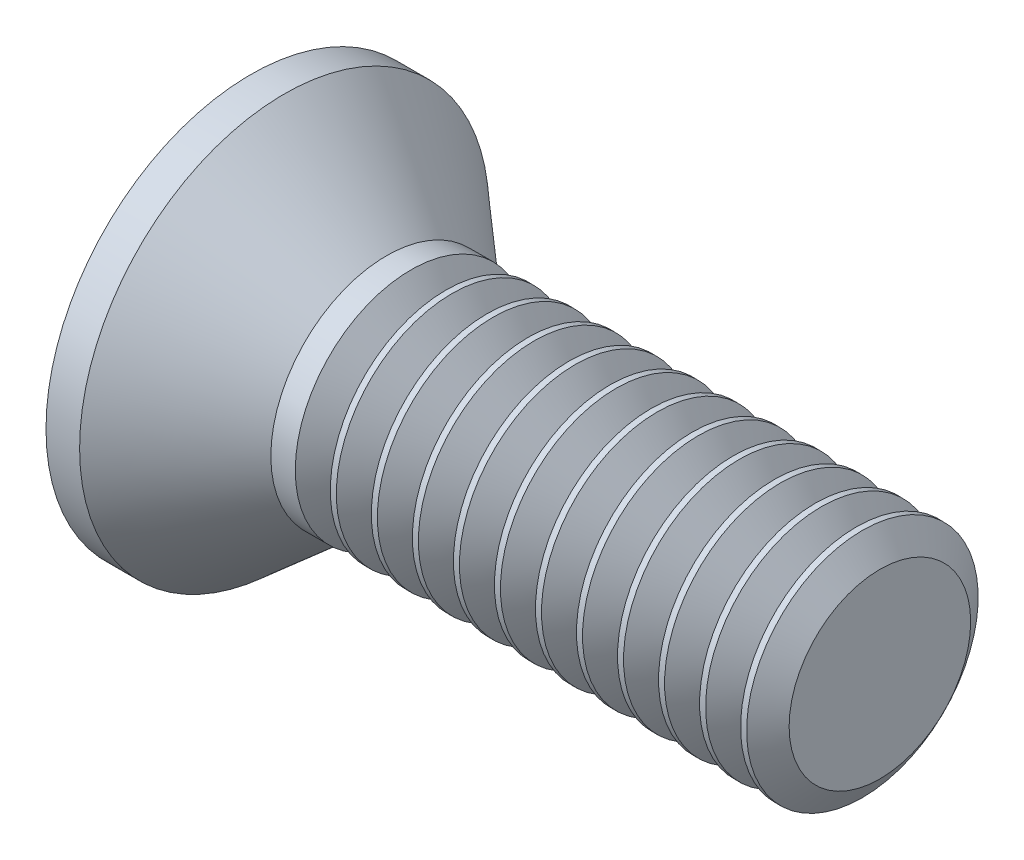
ISO-10303-21;
HEADER;
FILE_DESCRIPTION(('STEP AP214'),'2;1');
FILE_NAME('part.step','',(''),(''),'','','');
FILE_SCHEMA(('AUTOMOTIVE_DESIGN { 1 0 10303 214 1 1 1 1 }'));
ENDSEC;
DATA;
#1=APPLICATION_CONTEXT('core data for automotive mechanical design processes');
#2=APPLICATION_PROTOCOL_DEFINITION('international standard','automotive_design',2000,#1);
#3=PRODUCT_CONTEXT('',#1,'mechanical');
#4=PRODUCT('Part','Part','',(#3));
#5=PRODUCT_RELATED_PRODUCT_CATEGORY('part','',(#4));
#6=PRODUCT_DEFINITION_FORMATION('','',#4);
#7=PRODUCT_DEFINITION_CONTEXT('part definition',#1,'design');
#8=PRODUCT_DEFINITION('design','',#6,#7);
#9=PRODUCT_DEFINITION_SHAPE('','',#8);
#10=(LENGTH_UNIT() NAMED_UNIT(*) SI_UNIT(.MILLI.,.METRE.));
#11=(NAMED_UNIT(*) PLANE_ANGLE_UNIT() SI_UNIT($,.RADIAN.));
#12=(NAMED_UNIT(*) SI_UNIT($,.STERADIAN.) SOLID_ANGLE_UNIT());
#13=UNCERTAINTY_MEASURE_WITH_UNIT(LENGTH_MEASURE(1.E-05),#10,'distance_accuracy_value','');
#14=(GEOMETRIC_REPRESENTATION_CONTEXT(3) GLOBAL_UNCERTAINTY_ASSIGNED_CONTEXT((#13)) GLOBAL_UNIT_ASSIGNED_CONTEXT((#10,
#11,#12)) REPRESENTATION_CONTEXT('',''));
#15=CARTESIAN_POINT('',(0.,0.,0.));
#16=DIRECTION('',(0.,0.,1.));
#17=DIRECTION('',(1.,0.,0.));
#18=AXIS2_PLACEMENT_3D('',#15,#16,#17);
#19=CARTESIAN_POINT('',(0.,0.,0.));
#20=DIRECTION('',(-1.,0.,0.));
#21=DIRECTION('',(0.,0.,1.));
#22=AXIS2_PLACEMENT_3D('',#19,#20,#21);
#23=PLANE('',#22);
#24=CARTESIAN_POINT('',(0.,0.,0.));
#25=DIRECTION('',(-1.,0.,0.));
#26=DIRECTION('',(0.,0.,1.));
#27=AXIS2_PLACEMENT_3D('',#24,#25,#26);
#28=CIRCLE('',#27,3.0988);
#29=CARTESIAN_POINT('',(0.,0.,3.0988));
#30=VERTEX_POINT('',#29);
#31=EDGE_CURVE('E42',#30,#30,#28,.T.);
#32=ORIENTED_EDGE('',*,*,#31,.T.);
#33=EDGE_LOOP('',(#32));
#34=FACE_BOUND('',#33,.T.);
#35=DIRECTION('',(0.,1.,0.));
#36=VECTOR('',#35,1.);
#37=CARTESIAN_POINT('',(0.,-2.4765,-0.4826));
#38=LINE('',#37,#36);
#39=CARTESIAN_POINT('',(0.,-2.4765,-0.4826));
#40=VERTEX_POINT('',#39);
#41=CARTESIAN_POINT('',(0.,-0.482599999999998,-0.4826));
#42=VERTEX_POINT('',#41);
#43=EDGE_CURVE('E103',#40,#42,#38,.T.);
#44=ORIENTED_EDGE('',*,*,#43,.T.);
#45=DIRECTION('',(0.,0.,-1.));
#46=VECTOR('',#45,1.);
#47=CARTESIAN_POINT('',(0.,-0.482600000000008,2.4765));
#48=LINE('',#47,#46);
#49=CARTESIAN_POINT('',(0.,-0.482599999999992,-2.4765));
#50=VERTEX_POINT('',#49);
#51=EDGE_CURVE('E83',#42,#50,#48,.T.);
#52=ORIENTED_EDGE('',*,*,#51,.T.);
#53=DIRECTION('',(0.,1.,0.));
#54=VECTOR('',#53,1.);
#55=CARTESIAN_POINT('',(0.,-0.482599999999992,-2.4765));
#56=LINE('',#55,#54);
#57=CARTESIAN_POINT('',(0.,0.482600000000008,-2.4765));
#58=VERTEX_POINT('',#57);
#59=EDGE_CURVE('E434',#50,#58,#56,.T.);
#60=ORIENTED_EDGE('',*,*,#59,.T.);
#61=DIRECTION('',(0.,0.,1.));
#62=VECTOR('',#61,1.);
#63=CARTESIAN_POINT('',(0.,0.482600000000008,-2.4765));
#64=LINE('',#63,#62);
#65=CARTESIAN_POINT('',(0.,0.482600000000001,-0.4826));
#66=VERTEX_POINT('',#65);
#67=EDGE_CURVE('E99',#58,#66,#64,.T.);
#68=ORIENTED_EDGE('',*,*,#67,.T.);
#69=CARTESIAN_POINT('',(0.,2.4765,-0.4826));
#70=VERTEX_POINT('',#69);
#71=EDGE_CURVE('E93',#66,#70,#38,.T.);
#72=ORIENTED_EDGE('',*,*,#71,.T.);
#73=DIRECTION('',(0.,0.,1.));
#74=VECTOR('',#73,1.);
#75=CARTESIAN_POINT('',(0.,2.4765,-0.4826));
#76=LINE('',#75,#74);
#77=CARTESIAN_POINT('',(0.,2.4765,0.4826));
#78=VERTEX_POINT('',#77);
#79=EDGE_CURVE('E96',#70,#78,#76,.T.);
#80=ORIENTED_EDGE('',*,*,#79,.T.);
#81=DIRECTION('',(0.,-1.,0.));
#82=VECTOR('',#81,1.);
#83=CARTESIAN_POINT('',(0.,2.4765,0.4826));
#84=LINE('',#83,#82);
#85=CARTESIAN_POINT('',(0.,0.482599999999998,0.4826));
#86=VERTEX_POINT('',#85);
#87=EDGE_CURVE('E452',#78,#86,#84,.T.);
#88=ORIENTED_EDGE('',*,*,#87,.T.);
#89=CARTESIAN_POINT('',(0.,0.482599999999991,2.4765));
#90=VERTEX_POINT('',#89);
#91=EDGE_CURVE('E437',#86,#90,#64,.T.);
#92=ORIENTED_EDGE('',*,*,#91,.T.);
#93=DIRECTION('',(0.,-1.,0.));
#94=VECTOR('',#93,1.);
#95=CARTESIAN_POINT('',(0.,0.482599999999991,2.4765));
#96=LINE('',#95,#94);
#97=CARTESIAN_POINT('',(0.,-0.482600000000008,2.4765));
#98=VERTEX_POINT('',#97);
#99=EDGE_CURVE('E428',#90,#98,#96,.T.);
#100=ORIENTED_EDGE('',*,*,#99,.T.);
#101=CARTESIAN_POINT('',(0.,-0.482600000000002,0.4826));
#102=VERTEX_POINT('',#101);
#103=EDGE_CURVE('E431',#98,#102,#48,.T.);
#104=ORIENTED_EDGE('',*,*,#103,.T.);
#105=CARTESIAN_POINT('',(0.,-2.4765,0.4826));
#106=VERTEX_POINT('',#105);
#107=EDGE_CURVE('E109',#102,#106,#84,.T.);
#108=ORIENTED_EDGE('',*,*,#107,.T.);
#109=DIRECTION('',(0.,0.,-1.));
#110=VECTOR('',#109,1.);
#111=CARTESIAN_POINT('',(0.,-2.4765,0.4826));
#112=LINE('',#111,#110);
#113=EDGE_CURVE('E132',#106,#40,#112,.T.);
#114=ORIENTED_EDGE('',*,*,#113,.T.);
#115=EDGE_LOOP('',(#44,#52,#60,#68,#72,#80,#88,#92,#100,#104,#108,#114));
#116=FACE_BOUND('',#115,.T.);
#117=ADVANCED_FACE('F35',(#34,#116),#23,.T.);
#118=CARTESIAN_POINT('',(3.18005113636364,0.,0.215250568181818));
#119=DIRECTION('',(-0.0837752602144701,0.,-0.996484674130013));
#120=DIRECTION('',(-0.996484674130013,0.,0.0837752602144701));
#121=AXIS2_PLACEMENT_3D('',#118,#119,#120);
#122=PLANE('',#121);
#123=ORIENTED_EDGE('',*,*,#107,.F.);
#124=DIRECTION('',(0.993006162058238,0.0834828189341,-0.0834828189340997));
#125=VECTOR('',#124,1.);
#126=CARTESIAN_POINT('',(3.19789518323365,-0.213750404949384,0.213750404949384));
#127=LINE('',#126,#125);
#128=CARTESIAN_POINT('',(2.8702,-0.241300000000001,0.241299999999999));
#129=VERTEX_POINT('',#128);
#130=EDGE_CURVE('E127',#102,#129,#127,.T.);
#131=ORIENTED_EDGE('',*,*,#130,.T.);
#132=DIRECTION('',(0.78724620786628,0.613076692851616,-0.0661844157055723));
#133=VECTOR('',#132,1.);
#134=CARTESIAN_POINT('',(0.,-2.4765,0.4826));
#135=LINE('',#134,#133);
#136=EDGE_CURVE('E104',#106,#129,#135,.T.);
#137=ORIENTED_EDGE('',*,*,#136,.F.);
#138=EDGE_LOOP('',(#123,#131,#137));
#139=FACE_BOUND('',#138,.T.);
#140=ADVANCED_FACE('F152',(#139),#122,.T.);
#141=DIRECTION('',(0.78724620786628,-0.613076692851616,-0.0661844157055721));
#142=VECTOR('',#141,1.);
#143=CARTESIAN_POINT('',(0.,2.4765,0.4826));
#144=LINE('',#143,#142);
#145=CARTESIAN_POINT('',(2.8702,0.2413,0.2413));
#146=VERTEX_POINT('',#145);
#147=EDGE_CURVE('E49',#78,#146,#144,.T.);
#148=ORIENTED_EDGE('',*,*,#147,.T.);
#149=DIRECTION('',(-0.993006162058238,0.0834828189340994,0.0834828189340997));
#150=VECTOR('',#149,1.);
#151=CARTESIAN_POINT('',(3.19789518323365,0.213750404949383,0.213750404949384));
#152=LINE('',#151,#150);
#153=EDGE_CURVE('E447',#146,#86,#152,.T.);
#154=ORIENTED_EDGE('',*,*,#153,.T.);
#155=ORIENTED_EDGE('',*,*,#87,.F.);
#156=EDGE_LOOP('',(#148,#154,#155));
#157=FACE_BOUND('',#156,.T.);
#158=ADVANCED_FACE('F156',(#157),#122,.T.);
#159=CARTESIAN_POINT('',(3.18005113636364,0.,-0.215250568181818));
#160=DIRECTION('',(-0.0837752602144701,0.,0.996484674130013));
#161=DIRECTION('',(0.996484674130013,0.,0.0837752602144701));
#162=AXIS2_PLACEMENT_3D('',#159,#160,#161);
#163=PLANE('',#162);
#164=DIRECTION('',(0.78724620786628,0.613076692851616,0.0661844157055721));
#165=VECTOR('',#164,1.);
#166=CARTESIAN_POINT('',(0.,-2.4765,-0.4826));
#167=LINE('',#166,#165);
#168=CARTESIAN_POINT('',(2.8702,-0.241299999999999,-0.241300000000001));
#169=VERTEX_POINT('',#168);
#170=EDGE_CURVE('E58',#40,#169,#167,.T.);
#171=ORIENTED_EDGE('',*,*,#170,.T.);
#172=DIRECTION('',(-0.993006162058238,-0.0834828189340994,-0.0834828189340996));
#173=VECTOR('',#172,1.);
#174=CARTESIAN_POINT('',(3.19789518323365,-0.213750404949383,-0.213750404949384));
#175=LINE('',#174,#173);
#176=EDGE_CURVE('E11',#169,#42,#175,.T.);
#177=ORIENTED_EDGE('',*,*,#176,.T.);
#178=ORIENTED_EDGE('',*,*,#43,.F.);
#179=EDGE_LOOP('',(#171,#177,#178));
#180=FACE_BOUND('',#179,.T.);
#181=ADVANCED_FACE('F149',(#180),#163,.T.);
#182=ORIENTED_EDGE('',*,*,#71,.F.);
#183=DIRECTION('',(0.993006162058238,-0.0834828189340999,0.0834828189340996));
#184=VECTOR('',#183,1.);
#185=CARTESIAN_POINT('',(3.19789518323365,0.213750404949384,-0.213750404949384));
#186=LINE('',#185,#184);
#187=CARTESIAN_POINT('',(2.8702,0.2413,-0.2413));
#188=VERTEX_POINT('',#187);
#189=EDGE_CURVE('E112',#66,#188,#186,.T.);
#190=ORIENTED_EDGE('',*,*,#189,.T.);
#191=DIRECTION('',(0.78724620786628,-0.613076692851616,0.0661844157055721));
#192=VECTOR('',#191,1.);
#193=CARTESIAN_POINT('',(0.,2.4765,-0.4826));
#194=LINE('',#193,#192);
#195=EDGE_CURVE('E108',#70,#188,#194,.T.);
#196=ORIENTED_EDGE('',*,*,#195,.F.);
#197=EDGE_LOOP('',(#182,#190,#196));
#198=FACE_BOUND('',#197,.T.);
#199=ADVANCED_FACE('F111',(#198),#163,.T.);
#200=CARTESIAN_POINT('',(-6.34999999999999,0.,0.));
#201=DIRECTION('',(-1.,0.,0.));
#202=DIRECTION('',(0.,0.,1.));
#203=AXIS2_PLACEMENT_3D('',#200,#201,#202);
#204=CYLINDRICAL_SURFACE('',#203,3.0988);
#205=CARTESIAN_POINT('',(0.508774050199084,0.,0.));
#206=DIRECTION('',(-1.,0.,0.));
#207=DIRECTION('',(0.,0.,1.));
#208=AXIS2_PLACEMENT_3D('',#205,#206,#207);
#209=CIRCLE('',#208,3.0988);
#210=CARTESIAN_POINT('',(0.508774050199084,0.,3.0988));
#211=VERTEX_POINT('',#210);
#212=EDGE_CURVE('E131',#211,#211,#209,.T.);
#213=ORIENTED_EDGE('',*,*,#212,.T.);
#214=EDGE_LOOP('',(#213));
#215=FACE_BOUND('',#214,.T.);
#216=ORIENTED_EDGE('',*,*,#31,.F.);
#217=EDGE_LOOP('',(#216));
#218=FACE_BOUND('',#217,.T.);
#219=ADVANCED_FACE('F138',(#215,#218),#204,.T.);
#220=CARTESIAN_POINT('',(0.508774050199084,0.,0.));
#221=DIRECTION('',(-1.,0.,0.));
#222=DIRECTION('',(0.,0.,1.));
#223=AXIS2_PLACEMENT_3D('',#220,#221,#222);
#224=CONICAL_SURFACE('',#223,3.0988,0.715584993317677);
#225=CARTESIAN_POINT('',(2.0574,0.,0.));
#226=DIRECTION('',(-1.,0.,0.));
#227=DIRECTION('',(0.,0.,1.));
#228=AXIS2_PLACEMENT_3D('',#225,#226,#227);
#229=CIRCLE('',#228,1.7526);
#230=CARTESIAN_POINT('',(2.0574,0.,1.7526));
#231=VERTEX_POINT('',#230);
#232=EDGE_CURVE('E128',#231,#231,#229,.T.);
#233=ORIENTED_EDGE('',*,*,#232,.T.);
#234=EDGE_LOOP('',(#233));
#235=FACE_BOUND('',#234,.T.);
#236=ORIENTED_EDGE('',*,*,#212,.F.);
#237=EDGE_LOOP('',(#236));
#238=FACE_BOUND('',#237,.T.);
#239=ADVANCED_FACE('F140',(#235,#238),#224,.T.);
#240=CARTESIAN_POINT('',(-6.34999999999999,0.,0.));
#241=DIRECTION('',(-1.,0.,0.));
#242=DIRECTION('',(0.,0.,1.));
#243=AXIS2_PLACEMENT_3D('',#240,#241,#242);
#244=CYLINDRICAL_SURFACE('',#243,1.7526);
#245=CARTESIAN_POINT('',(2.42742485508915,0.,0.));
#246=DIRECTION('',(-1.,0.,0.));
#247=DIRECTION('',(0.,-1.,0.));
#248=AXIS2_PLACEMENT_3D('',#245,#246,#247);
#249=CIRCLE('',#248,1.7526);
#250=CARTESIAN_POINT('',(2.42742485508915,-1.7526,0.));
#251=VERTEX_POINT('',#250);
#252=EDGE_CURVE('E422',#251,#251,#249,.T.);
#253=ORIENTED_EDGE('',*,*,#252,.T.);
#254=EDGE_LOOP('',(#253));
#255=FACE_BOUND('',#254,.T.);
#256=ORIENTED_EDGE('',*,*,#232,.F.);
#257=EDGE_LOOP('',(#256));
#258=FACE_BOUND('',#257,.T.);
#259=ADVANCED_FACE('F146',(#255,#258),#244,.T.);
#260=CARTESIAN_POINT('',(2.8702,-0.2413,-0.2413));
#261=DIRECTION('',(-1.,0.,0.));
#262=DIRECTION('',(0.,0.,1.));
#263=AXIS2_PLACEMENT_3D('',#260,#261,#262);
#264=PLANE('',#263);
#265=DIRECTION('',(0.,1.,0.));
#266=VECTOR('',#265,1.);
#267=CARTESIAN_POINT('',(2.8702,-0.2413,-0.2413));
#268=LINE('',#267,#266);
#269=EDGE_CURVE('E123',#169,#188,#268,.T.);
#270=ORIENTED_EDGE('',*,*,#269,.F.);
#271=DIRECTION('',(0.,0.,-1.));
#272=VECTOR('',#271,1.);
#273=CARTESIAN_POINT('',(2.8702,-0.2413,0.2413));
#274=LINE('',#273,#272);
#275=EDGE_CURVE('E114',#129,#169,#274,.T.);
#276=ORIENTED_EDGE('',*,*,#275,.F.);
#277=DIRECTION('',(0.,-1.,0.));
#278=VECTOR('',#277,1.);
#279=CARTESIAN_POINT('',(2.8702,0.2413,0.2413));
#280=LINE('',#279,#278);
#281=EDGE_CURVE('E117',#146,#129,#280,.T.);
#282=ORIENTED_EDGE('',*,*,#281,.F.);
#283=DIRECTION('',(0.,0.,1.));
#284=VECTOR('',#283,1.);
#285=CARTESIAN_POINT('',(2.8702,0.2413,-0.2413));
#286=LINE('',#285,#284);
#287=EDGE_CURVE('E121',#188,#146,#286,.T.);
#288=ORIENTED_EDGE('',*,*,#287,.F.);
#289=EDGE_LOOP('',(#270,#276,#282,#288));
#290=FACE_BOUND('',#289,.T.);
#291=ADVANCED_FACE('F173',(#290),#264,.T.);
#292=CARTESIAN_POINT('',(0.,-2.4765,-0.4826));
#293=DIRECTION('',(-0.614423873827266,0.788976110710012,0.));
#294=DIRECTION('',(-0.788976110710012,-0.614423873827266,0.));
#295=AXIS2_PLACEMENT_3D('',#292,#293,#294);
#296=PLANE('',#295);
#297=ORIENTED_EDGE('',*,*,#170,.F.);
#298=ORIENTED_EDGE('',*,*,#113,.F.);
#299=ORIENTED_EDGE('',*,*,#136,.T.);
#300=ORIENTED_EDGE('',*,*,#275,.T.);
#301=EDGE_LOOP('',(#297,#298,#299,#300));
#302=FACE_BOUND('',#301,.T.);
#303=ADVANCED_FACE('F165',(#302),#296,.T.);
#304=CARTESIAN_POINT('',(2.8702,0.2413,0.2413));
#305=DIRECTION('',(-0.614423873827266,-0.788976110710012,0.));
#306=DIRECTION('',(0.788976110710012,-0.614423873827266,0.));
#307=AXIS2_PLACEMENT_3D('',#304,#305,#306);
#308=PLANE('',#307);
#309=ORIENTED_EDGE('',*,*,#147,.F.);
#310=ORIENTED_EDGE('',*,*,#79,.F.);
#311=ORIENTED_EDGE('',*,*,#195,.T.);
#312=ORIENTED_EDGE('',*,*,#287,.T.);
#313=EDGE_LOOP('',(#309,#310,#311,#312));
#314=FACE_BOUND('',#313,.T.);
#315=ADVANCED_FACE('F107',(#314),#308,.T.);
#316=CARTESIAN_POINT('',(3.18005113636364,-0.215250568181818,0.));
#317=DIRECTION('',(-0.0837752602144701,0.996484674130013,0.));
#318=DIRECTION('',(-0.996484674130013,-0.0837752602144701,0.));
#319=AXIS2_PLACEMENT_3D('',#316,#317,#318);
#320=PLANE('',#319);
#321=DIRECTION('',(0.78724620786628,0.0661844157055701,0.613076692851616));
#322=VECTOR('',#321,1.);
#323=CARTESIAN_POINT('',(0.,-0.482599999999992,-2.4765));
#324=LINE('',#323,#322);
#325=EDGE_CURVE('E438',#50,#169,#324,.T.);
#326=ORIENTED_EDGE('',*,*,#325,.F.);
#327=ORIENTED_EDGE('',*,*,#51,.F.);
#328=ORIENTED_EDGE('',*,*,#176,.F.);
#329=EDGE_LOOP('',(#326,#327,#328));
#330=FACE_BOUND('',#329,.T.);
#331=ADVANCED_FACE('F172',(#330),#320,.T.);
#332=CARTESIAN_POINT('',(3.18005113636364,0.215250568181818,0.));
#333=DIRECTION('',(-0.0837752602144701,-0.996484674130013,0.));
#334=DIRECTION('',(0.996484674130013,-0.0837752602144701,0.));
#335=AXIS2_PLACEMENT_3D('',#332,#333,#334);
#336=PLANE('',#335);
#337=ORIENTED_EDGE('',*,*,#67,.F.);
#338=DIRECTION('',(0.78724620786628,-0.0661844157055743,0.613076692851616));
#339=VECTOR('',#338,1.);
#340=CARTESIAN_POINT('',(0.,0.482600000000008,-2.4765));
#341=LINE('',#340,#339);
#342=EDGE_CURVE('E74',#58,#188,#341,.T.);
#343=ORIENTED_EDGE('',*,*,#342,.T.);
#344=ORIENTED_EDGE('',*,*,#189,.F.);
#345=EDGE_LOOP('',(#337,#343,#344));
#346=FACE_BOUND('',#345,.T.);
#347=ADVANCED_FACE('F490',(#346),#336,.T.);
#348=CARTESIAN_POINT('',(0.,0.482600000000008,-2.4765));
#349=DIRECTION('',(-0.614423873827266,0.,0.788976110710012));
#350=DIRECTION('',(-0.788976110710012,0.,-0.614423873827266));
#351=AXIS2_PLACEMENT_3D('',#348,#349,#350);
#352=PLANE('',#351);
#353=ORIENTED_EDGE('',*,*,#342,.F.);
#354=ORIENTED_EDGE('',*,*,#59,.F.);
#355=ORIENTED_EDGE('',*,*,#325,.T.);
#356=ORIENTED_EDGE('',*,*,#269,.T.);
#357=EDGE_LOOP('',(#353,#354,#355,#356));
#358=FACE_BOUND('',#357,.T.);
#359=ADVANCED_FACE('F489',(#358),#352,.T.);
#360=ORIENTED_EDGE('',*,*,#103,.F.);
#361=DIRECTION('',(0.78724620786628,0.0661844157055742,-0.613076692851616));
#362=VECTOR('',#361,1.);
#363=CARTESIAN_POINT('',(0.,-0.482600000000008,2.4765));
#364=LINE('',#363,#362);
#365=EDGE_CURVE('E442',#98,#129,#364,.T.);
#366=ORIENTED_EDGE('',*,*,#365,.T.);
#367=ORIENTED_EDGE('',*,*,#130,.F.);
#368=EDGE_LOOP('',(#360,#366,#367));
#369=FACE_BOUND('',#368,.T.);
#370=ADVANCED_FACE('F482',(#369),#320,.T.);
#371=DIRECTION('',(0.78724620786628,-0.06618441570557,-0.613076692851616));
#372=VECTOR('',#371,1.);
#373=CARTESIAN_POINT('',(0.,0.482599999999991,2.4765));
#374=LINE('',#373,#372);
#375=EDGE_CURVE('E427',#90,#146,#374,.T.);
#376=ORIENTED_EDGE('',*,*,#375,.F.);
#377=ORIENTED_EDGE('',*,*,#91,.F.);
#378=ORIENTED_EDGE('',*,*,#153,.F.);
#379=EDGE_LOOP('',(#376,#377,#378));
#380=FACE_BOUND('',#379,.T.);
#381=ADVANCED_FACE('F470',(#380),#336,.T.);
#382=CARTESIAN_POINT('',(2.8702,-0.241300000000001,0.241299999999999));
#383=DIRECTION('',(-0.614423873827266,0.,-0.788976110710012));
#384=DIRECTION('',(0.788976110710012,0.,-0.614423873827266));
#385=AXIS2_PLACEMENT_3D('',#382,#383,#384);
#386=PLANE('',#385);
#387=ORIENTED_EDGE('',*,*,#365,.F.);
#388=ORIENTED_EDGE('',*,*,#99,.F.);
#389=ORIENTED_EDGE('',*,*,#375,.T.);
#390=ORIENTED_EDGE('',*,*,#281,.T.);
#391=EDGE_LOOP('',(#387,#388,#389,#390));
#392=FACE_BOUND('',#391,.T.);
#393=ADVANCED_FACE('F476',(#392),#386,.T.);
#394=CARTESIAN_POINT('',(2.95742594491084,0.,0.));
#395=DIRECTION('',(1.,0.,0.));
#396=DIRECTION('',(0.,1.,0.));
#397=AXIS2_PLACEMENT_3D('',#394,#395,#396);
#398=CONICAL_SURFACE('',#397,1.7526,0.959931088596885);
#399=CARTESIAN_POINT('',(2.6924254,0.,0.));
#400=DIRECTION('',(-1.,0.,0.));
#401=DIRECTION('',(0.,-1.,0.));
#402=AXIS2_PLACEMENT_3D('',#399,#400,#401);
#403=CIRCLE('',#402,1.37414);
#404=CARTESIAN_POINT('',(2.6924254,-1.37414,0.));
#405=VERTEX_POINT('',#404);
#406=EDGE_CURVE('E419',#405,#405,#403,.T.);
#407=ORIENTED_EDGE('',*,*,#406,.F.);
#408=EDGE_LOOP('',(#407));
#409=FACE_BOUND('',#408,.T.);
#410=CARTESIAN_POINT('',(2.95742594491084,0.,0.));
#411=DIRECTION('',(-1.,0.,0.));
#412=DIRECTION('',(0.,-1.,0.));
#413=AXIS2_PLACEMENT_3D('',#410,#411,#412);
#414=CIRCLE('',#413,1.7526);
#415=CARTESIAN_POINT('',(2.95742594491084,-1.7526,0.));
#416=VERTEX_POINT('',#415);
#417=EDGE_CURVE('E424',#416,#416,#414,.T.);
#418=ORIENTED_EDGE('',*,*,#417,.T.);
#419=EDGE_LOOP('',(#418));
#420=FACE_BOUND('',#419,.T.);
#421=ADVANCED_FACE('F206',(#409,#420),#398,.T.);
#422=CARTESIAN_POINT('',(2.6924254,0.,0.));
#423=DIRECTION('',(-1.,0.,0.));
#424=DIRECTION('',(0.,-1.,0.));
#425=AXIS2_PLACEMENT_3D('',#422,#423,#424);
#426=CONICAL_SURFACE('',#425,1.37414,0.959931088596876);
#427=ORIENTED_EDGE('',*,*,#252,.F.);
#428=EDGE_LOOP('',(#427));
#429=FACE_BOUND('',#428,.T.);
#430=ORIENTED_EDGE('',*,*,#406,.T.);
#431=EDGE_LOOP('',(#430));
#432=FACE_BOUND('',#431,.T.);
#433=ADVANCED_FACE('F196',(#429,#432),#426,.T.);
#434=CARTESIAN_POINT('',(3.0485703096346,0.,0.));
#435=DIRECTION('',(-1.,0.,0.));
#436=DIRECTION('',(0.,-1.,0.));
#437=AXIS2_PLACEMENT_3D('',#434,#435,#436);
#438=CIRCLE('',#437,1.7526);
#439=CARTESIAN_POINT('',(3.0485703096346,-1.7526,0.));
#440=VERTEX_POINT('',#439);
#441=EDGE_CURVE('E414',#440,#440,#438,.T.);
#442=ORIENTED_EDGE('',*,*,#441,.T.);
#443=EDGE_LOOP('',(#442));
#444=FACE_BOUND('',#443,.T.);
#445=ORIENTED_EDGE('',*,*,#417,.F.);
#446=EDGE_LOOP('',(#445));
#447=FACE_BOUND('',#446,.T.);
#448=ADVANCED_FACE('F185',(#444,#447),#244,.T.);
#449=CARTESIAN_POINT('',(3.5785713994563,0.,0.));
#450=DIRECTION('',(1.,0.,0.));
#451=DIRECTION('',(0.,1.,0.));
#452=AXIS2_PLACEMENT_3D('',#449,#450,#451);
#453=CONICAL_SURFACE('',#452,1.7526,0.959931088596885);
#454=CARTESIAN_POINT('',(3.31357085454545,0.,0.));
#455=DIRECTION('',(-1.,0.,0.));
#456=DIRECTION('',(0.,-1.,0.));
#457=AXIS2_PLACEMENT_3D('',#454,#455,#456);
#458=CIRCLE('',#457,1.37414);
#459=CARTESIAN_POINT('',(3.31357085454545,-1.37414,0.));
#460=VERTEX_POINT('',#459);
#461=EDGE_CURVE('E411',#460,#460,#458,.T.);
#462=ORIENTED_EDGE('',*,*,#461,.F.);
#463=EDGE_LOOP('',(#462));
#464=FACE_BOUND('',#463,.T.);
#465=CARTESIAN_POINT('',(3.5785713994563,0.,0.));
#466=DIRECTION('',(-1.,0.,0.));
#467=DIRECTION('',(0.,-1.,0.));
#468=AXIS2_PLACEMENT_3D('',#465,#466,#467);
#469=CIRCLE('',#468,1.7526);
#470=CARTESIAN_POINT('',(3.5785713994563,-1.7526,0.));
#471=VERTEX_POINT('',#470);
#472=EDGE_CURVE('E416',#471,#471,#469,.T.);
#473=ORIENTED_EDGE('',*,*,#472,.T.);
#474=EDGE_LOOP('',(#473));
#475=FACE_BOUND('',#474,.T.);
#476=ADVANCED_FACE('F195',(#464,#475),#453,.T.);
#477=CARTESIAN_POINT('',(3.31357085454545,0.,0.));
#478=DIRECTION('',(-1.,0.,0.));
#479=DIRECTION('',(0.,-1.,0.));
#480=AXIS2_PLACEMENT_3D('',#477,#478,#479);
#481=CONICAL_SURFACE('',#480,1.37414,0.959931088596876);
#482=ORIENTED_EDGE('',*,*,#441,.F.);
#483=EDGE_LOOP('',(#482));
#484=FACE_BOUND('',#483,.T.);
#485=ORIENTED_EDGE('',*,*,#461,.T.);
#486=EDGE_LOOP('',(#485));
#487=FACE_BOUND('',#486,.T.);
#488=ADVANCED_FACE('F203',(#484,#487),#481,.T.);
#489=CARTESIAN_POINT('',(3.66971576418006,0.,0.));
#490=DIRECTION('',(-1.,0.,0.));
#491=DIRECTION('',(0.,-1.,0.));
#492=AXIS2_PLACEMENT_3D('',#489,#490,#491);
#493=CIRCLE('',#492,1.7526);
#494=CARTESIAN_POINT('',(3.66971576418006,-1.7526,0.));
#495=VERTEX_POINT('',#494);
#496=EDGE_CURVE('E406',#495,#495,#493,.T.);
#497=ORIENTED_EDGE('',*,*,#496,.T.);
#498=EDGE_LOOP('',(#497));
#499=FACE_BOUND('',#498,.T.);
#500=ORIENTED_EDGE('',*,*,#472,.F.);
#501=EDGE_LOOP('',(#500));
#502=FACE_BOUND('',#501,.T.);
#503=ADVANCED_FACE('F198',(#499,#502),#244,.T.);
#504=CARTESIAN_POINT('',(4.19971685400175,0.,0.));
#505=DIRECTION('',(1.,0.,0.));
#506=DIRECTION('',(0.,1.,0.));
#507=AXIS2_PLACEMENT_3D('',#504,#505,#506);
#508=CONICAL_SURFACE('',#507,1.7526,0.959931088596885);
#509=CARTESIAN_POINT('',(3.93471630909091,0.,0.));
#510=DIRECTION('',(-1.,0.,0.));
#511=DIRECTION('',(0.,-1.,0.));
#512=AXIS2_PLACEMENT_3D('',#509,#510,#511);
#513=CIRCLE('',#512,1.37414);
#514=CARTESIAN_POINT('',(3.93471630909091,-1.37414,0.));
#515=VERTEX_POINT('',#514);
#516=EDGE_CURVE('E403',#515,#515,#513,.T.);
#517=ORIENTED_EDGE('',*,*,#516,.F.);
#518=EDGE_LOOP('',(#517));
#519=FACE_BOUND('',#518,.T.);
#520=CARTESIAN_POINT('',(4.19971685400175,0.,0.));
#521=DIRECTION('',(-1.,0.,0.));
#522=DIRECTION('',(0.,-1.,0.));
#523=AXIS2_PLACEMENT_3D('',#520,#521,#522);
#524=CIRCLE('',#523,1.7526);
#525=CARTESIAN_POINT('',(4.19971685400175,-1.7526,0.));
#526=VERTEX_POINT('',#525);
#527=EDGE_CURVE('E408',#526,#526,#524,.T.);
#528=ORIENTED_EDGE('',*,*,#527,.T.);
#529=EDGE_LOOP('',(#528));
#530=FACE_BOUND('',#529,.T.);
#531=ADVANCED_FACE('F212',(#519,#530),#508,.T.);
#532=CARTESIAN_POINT('',(3.93471630909091,0.,0.));
#533=DIRECTION('',(-1.,0.,0.));
#534=DIRECTION('',(0.,-1.,0.));
#535=AXIS2_PLACEMENT_3D('',#532,#533,#534);
#536=CONICAL_SURFACE('',#535,1.37414,0.959931088596876);
#537=ORIENTED_EDGE('',*,*,#496,.F.);
#538=EDGE_LOOP('',(#537));
#539=FACE_BOUND('',#538,.T.);
#540=ORIENTED_EDGE('',*,*,#516,.T.);
#541=EDGE_LOOP('',(#540));
#542=FACE_BOUND('',#541,.T.);
#543=ADVANCED_FACE('F219',(#539,#542),#536,.T.);
#544=CARTESIAN_POINT('',(4.29086121872551,0.,0.));
#545=DIRECTION('',(-1.,0.,0.));
#546=DIRECTION('',(0.,-1.,0.));
#547=AXIS2_PLACEMENT_3D('',#544,#545,#546);
#548=CIRCLE('',#547,1.7526);
#549=CARTESIAN_POINT('',(4.29086121872551,-1.7526,0.));
#550=VERTEX_POINT('',#549);
#551=EDGE_CURVE('E398',#550,#550,#548,.T.);
#552=ORIENTED_EDGE('',*,*,#551,.T.);
#553=EDGE_LOOP('',(#552));
#554=FACE_BOUND('',#553,.T.);
#555=ORIENTED_EDGE('',*,*,#527,.F.);
#556=EDGE_LOOP('',(#555));
#557=FACE_BOUND('',#556,.T.);
#558=ADVANCED_FACE('F214',(#554,#557),#244,.T.);
#559=CARTESIAN_POINT('',(4.82086230854721,0.,0.));
#560=DIRECTION('',(1.,0.,0.));
#561=DIRECTION('',(0.,1.,0.));
#562=AXIS2_PLACEMENT_3D('',#559,#560,#561);
#563=CONICAL_SURFACE('',#562,1.7526,0.959931088596885);
#564=CARTESIAN_POINT('',(4.55586176363636,0.,0.));
#565=DIRECTION('',(-1.,0.,0.));
#566=DIRECTION('',(0.,-1.,0.));
#567=AXIS2_PLACEMENT_3D('',#564,#565,#566);
#568=CIRCLE('',#567,1.37414);
#569=CARTESIAN_POINT('',(4.55586176363636,-1.37414,0.));
#570=VERTEX_POINT('',#569);
#571=EDGE_CURVE('E395',#570,#570,#568,.T.);
#572=ORIENTED_EDGE('',*,*,#571,.F.);
#573=EDGE_LOOP('',(#572));
#574=FACE_BOUND('',#573,.T.);
#575=CARTESIAN_POINT('',(4.82086230854721,0.,0.));
#576=DIRECTION('',(-1.,0.,0.));
#577=DIRECTION('',(0.,-1.,0.));
#578=AXIS2_PLACEMENT_3D('',#575,#576,#577);
#579=CIRCLE('',#578,1.7526);
#580=CARTESIAN_POINT('',(4.82086230854721,-1.7526,0.));
#581=VERTEX_POINT('',#580);
#582=EDGE_CURVE('E400',#581,#581,#579,.T.);
#583=ORIENTED_EDGE('',*,*,#582,.T.);
#584=EDGE_LOOP('',(#583));
#585=FACE_BOUND('',#584,.T.);
#586=ADVANCED_FACE('F227',(#574,#585),#563,.T.);
#587=CARTESIAN_POINT('',(4.55586176363636,0.,0.));
#588=DIRECTION('',(-1.,0.,0.));
#589=DIRECTION('',(0.,-1.,0.));
#590=AXIS2_PLACEMENT_3D('',#587,#588,#589);
#591=CONICAL_SURFACE('',#590,1.37414,0.959931088596876);
#592=ORIENTED_EDGE('',*,*,#551,.F.);
#593=EDGE_LOOP('',(#592));
#594=FACE_BOUND('',#593,.T.);
#595=ORIENTED_EDGE('',*,*,#571,.T.);
#596=EDGE_LOOP('',(#595));
#597=FACE_BOUND('',#596,.T.);
#598=ADVANCED_FACE('F234',(#594,#597),#591,.T.);
#599=CARTESIAN_POINT('',(4.91200667327097,0.,0.));
#600=DIRECTION('',(-1.,0.,0.));
#601=DIRECTION('',(0.,-1.,0.));
#602=AXIS2_PLACEMENT_3D('',#599,#600,#601);
#603=CIRCLE('',#602,1.7526);
#604=CARTESIAN_POINT('',(4.91200667327097,-1.7526,0.));
#605=VERTEX_POINT('',#604);
#606=EDGE_CURVE('E390',#605,#605,#603,.T.);
#607=ORIENTED_EDGE('',*,*,#606,.T.);
#608=EDGE_LOOP('',(#607));
#609=FACE_BOUND('',#608,.T.);
#610=ORIENTED_EDGE('',*,*,#582,.F.);
#611=EDGE_LOOP('',(#610));
#612=FACE_BOUND('',#611,.T.);
#613=ADVANCED_FACE('F229',(#609,#612),#244,.T.);
#614=CARTESIAN_POINT('',(5.44200776309266,0.,0.));
#615=DIRECTION('',(1.,0.,0.));
#616=DIRECTION('',(0.,1.,0.));
#617=AXIS2_PLACEMENT_3D('',#614,#615,#616);
#618=CONICAL_SURFACE('',#617,1.7526,0.959931088596885);
#619=CARTESIAN_POINT('',(5.17700721818182,0.,0.));
#620=DIRECTION('',(-1.,0.,0.));
#621=DIRECTION('',(0.,-1.,0.));
#622=AXIS2_PLACEMENT_3D('',#619,#620,#621);
#623=CIRCLE('',#622,1.37414);
#624=CARTESIAN_POINT('',(5.17700721818182,-1.37414,0.));
#625=VERTEX_POINT('',#624);
#626=EDGE_CURVE('E387',#625,#625,#623,.T.);
#627=ORIENTED_EDGE('',*,*,#626,.F.);
#628=EDGE_LOOP('',(#627));
#629=FACE_BOUND('',#628,.T.);
#630=CARTESIAN_POINT('',(5.44200776309266,0.,0.));
#631=DIRECTION('',(-1.,0.,0.));
#632=DIRECTION('',(0.,-1.,0.));
#633=AXIS2_PLACEMENT_3D('',#630,#631,#632);
#634=CIRCLE('',#633,1.7526);
#635=CARTESIAN_POINT('',(5.44200776309266,-1.7526,0.));
#636=VERTEX_POINT('',#635);
#637=EDGE_CURVE('E392',#636,#636,#634,.T.);
#638=ORIENTED_EDGE('',*,*,#637,.T.);
#639=EDGE_LOOP('',(#638));
#640=FACE_BOUND('',#639,.T.);
#641=ADVANCED_FACE('F242',(#629,#640),#618,.T.);
#642=CARTESIAN_POINT('',(5.17700721818182,0.,0.));
#643=DIRECTION('',(-1.,0.,0.));
#644=DIRECTION('',(0.,-1.,0.));
#645=AXIS2_PLACEMENT_3D('',#642,#643,#644);
#646=CONICAL_SURFACE('',#645,1.37414,0.959931088596876);
#647=ORIENTED_EDGE('',*,*,#606,.F.);
#648=EDGE_LOOP('',(#647));
#649=FACE_BOUND('',#648,.T.);
#650=ORIENTED_EDGE('',*,*,#626,.T.);
#651=EDGE_LOOP('',(#650));
#652=FACE_BOUND('',#651,.T.);
#653=ADVANCED_FACE('F249',(#649,#652),#646,.T.);
#654=CARTESIAN_POINT('',(5.53315212781642,0.,0.));
#655=DIRECTION('',(-1.,0.,0.));
#656=DIRECTION('',(0.,-1.,0.));
#657=AXIS2_PLACEMENT_3D('',#654,#655,#656);
#658=CIRCLE('',#657,1.7526);
#659=CARTESIAN_POINT('',(5.53315212781642,-1.7526,0.));
#660=VERTEX_POINT('',#659);
#661=EDGE_CURVE('E382',#660,#660,#658,.T.);
#662=ORIENTED_EDGE('',*,*,#661,.T.);
#663=EDGE_LOOP('',(#662));
#664=FACE_BOUND('',#663,.T.);
#665=ORIENTED_EDGE('',*,*,#637,.F.);
#666=EDGE_LOOP('',(#665));
#667=FACE_BOUND('',#666,.T.);
#668=ADVANCED_FACE('F244',(#664,#667),#244,.T.);
#669=CARTESIAN_POINT('',(6.06315321763812,0.,0.));
#670=DIRECTION('',(1.,0.,0.));
#671=DIRECTION('',(0.,1.,0.));
#672=AXIS2_PLACEMENT_3D('',#669,#670,#671);
#673=CONICAL_SURFACE('',#672,1.7526,0.959931088596885);
#674=CARTESIAN_POINT('',(5.79815267272727,0.,0.));
#675=DIRECTION('',(-1.,0.,0.));
#676=DIRECTION('',(0.,-1.,0.));
#677=AXIS2_PLACEMENT_3D('',#674,#675,#676);
#678=CIRCLE('',#677,1.37414);
#679=CARTESIAN_POINT('',(5.79815267272727,-1.37414,0.));
#680=VERTEX_POINT('',#679);
#681=EDGE_CURVE('E379',#680,#680,#678,.T.);
#682=ORIENTED_EDGE('',*,*,#681,.F.);
#683=EDGE_LOOP('',(#682));
#684=FACE_BOUND('',#683,.T.);
#685=CARTESIAN_POINT('',(6.06315321763812,0.,0.));
#686=DIRECTION('',(-1.,0.,0.));
#687=DIRECTION('',(0.,-1.,0.));
#688=AXIS2_PLACEMENT_3D('',#685,#686,#687);
#689=CIRCLE('',#688,1.7526);
#690=CARTESIAN_POINT('',(6.06315321763812,-1.7526,0.));
#691=VERTEX_POINT('',#690);
#692=EDGE_CURVE('E384',#691,#691,#689,.T.);
#693=ORIENTED_EDGE('',*,*,#692,.T.);
#694=EDGE_LOOP('',(#693));
#695=FACE_BOUND('',#694,.T.);
#696=ADVANCED_FACE('F257',(#684,#695),#673,.T.);
#697=CARTESIAN_POINT('',(5.79815267272727,0.,0.));
#698=DIRECTION('',(-1.,0.,0.));
#699=DIRECTION('',(0.,-1.,0.));
#700=AXIS2_PLACEMENT_3D('',#697,#698,#699);
#701=CONICAL_SURFACE('',#700,1.37414,0.959931088596876);
#702=ORIENTED_EDGE('',*,*,#661,.F.);
#703=EDGE_LOOP('',(#702));
#704=FACE_BOUND('',#703,.T.);
#705=ORIENTED_EDGE('',*,*,#681,.T.);
#706=EDGE_LOOP('',(#705));
#707=FACE_BOUND('',#706,.T.);
#708=ADVANCED_FACE('F264',(#704,#707),#701,.T.);
#709=CARTESIAN_POINT('',(6.15429758236188,0.,0.));
#710=DIRECTION('',(-1.,0.,0.));
#711=DIRECTION('',(0.,-1.,0.));
#712=AXIS2_PLACEMENT_3D('',#709,#710,#711);
#713=CIRCLE('',#712,1.7526);
#714=CARTESIAN_POINT('',(6.15429758236188,-1.7526,0.));
#715=VERTEX_POINT('',#714);
#716=EDGE_CURVE('E374',#715,#715,#713,.T.);
#717=ORIENTED_EDGE('',*,*,#716,.T.);
#718=EDGE_LOOP('',(#717));
#719=FACE_BOUND('',#718,.T.);
#720=ORIENTED_EDGE('',*,*,#692,.F.);
#721=EDGE_LOOP('',(#720));
#722=FACE_BOUND('',#721,.T.);
#723=ADVANCED_FACE('F259',(#719,#722),#244,.T.);
#724=CARTESIAN_POINT('',(6.68429867218357,0.,0.));
#725=DIRECTION('',(1.,0.,0.));
#726=DIRECTION('',(0.,1.,0.));
#727=AXIS2_PLACEMENT_3D('',#724,#725,#726);
#728=CONICAL_SURFACE('',#727,1.7526,0.959931088596885);
#729=CARTESIAN_POINT('',(6.41929812727273,0.,0.));
#730=DIRECTION('',(-1.,0.,0.));
#731=DIRECTION('',(0.,-1.,0.));
#732=AXIS2_PLACEMENT_3D('',#729,#730,#731);
#733=CIRCLE('',#732,1.37414);
#734=CARTESIAN_POINT('',(6.41929812727273,-1.37414,0.));
#735=VERTEX_POINT('',#734);
#736=EDGE_CURVE('E371',#735,#735,#733,.T.);
#737=ORIENTED_EDGE('',*,*,#736,.F.);
#738=EDGE_LOOP('',(#737));
#739=FACE_BOUND('',#738,.T.);
#740=CARTESIAN_POINT('',(6.68429867218357,0.,0.));
#741=DIRECTION('',(-1.,0.,0.));
#742=DIRECTION('',(0.,-1.,0.));
#743=AXIS2_PLACEMENT_3D('',#740,#741,#742);
#744=CIRCLE('',#743,1.7526);
#745=CARTESIAN_POINT('',(6.68429867218357,-1.7526,0.));
#746=VERTEX_POINT('',#745);
#747=EDGE_CURVE('E376',#746,#746,#744,.T.);
#748=ORIENTED_EDGE('',*,*,#747,.T.);
#749=EDGE_LOOP('',(#748));
#750=FACE_BOUND('',#749,.T.);
#751=ADVANCED_FACE('F272',(#739,#750),#728,.T.);
#752=CARTESIAN_POINT('',(6.41929812727273,0.,0.));
#753=DIRECTION('',(-1.,0.,0.));
#754=DIRECTION('',(0.,-1.,0.));
#755=AXIS2_PLACEMENT_3D('',#752,#753,#754);
#756=CONICAL_SURFACE('',#755,1.37414,0.959931088596876);
#757=ORIENTED_EDGE('',*,*,#716,.F.);
#758=EDGE_LOOP('',(#757));
#759=FACE_BOUND('',#758,.T.);
#760=ORIENTED_EDGE('',*,*,#736,.T.);
#761=EDGE_LOOP('',(#760));
#762=FACE_BOUND('',#761,.T.);
#763=ADVANCED_FACE('F279',(#759,#762),#756,.T.);
#764=CARTESIAN_POINT('',(6.77544303690733,0.,0.));
#765=DIRECTION('',(-1.,0.,0.));
#766=DIRECTION('',(0.,-1.,0.));
#767=AXIS2_PLACEMENT_3D('',#764,#765,#766);
#768=CIRCLE('',#767,1.7526);
#769=CARTESIAN_POINT('',(6.77544303690733,-1.7526,0.));
#770=VERTEX_POINT('',#769);
#771=EDGE_CURVE('E366',#770,#770,#768,.T.);
#772=ORIENTED_EDGE('',*,*,#771,.T.);
#773=EDGE_LOOP('',(#772));
#774=FACE_BOUND('',#773,.T.);
#775=ORIENTED_EDGE('',*,*,#747,.F.);
#776=EDGE_LOOP('',(#775));
#777=FACE_BOUND('',#776,.T.);
#778=ADVANCED_FACE('F274',(#774,#777),#244,.T.);
#779=CARTESIAN_POINT('',(7.30544412672903,0.,0.));
#780=DIRECTION('',(1.,0.,0.));
#781=DIRECTION('',(0.,1.,0.));
#782=AXIS2_PLACEMENT_3D('',#779,#780,#781);
#783=CONICAL_SURFACE('',#782,1.7526,0.959931088596885);
#784=CARTESIAN_POINT('',(7.04044358181818,0.,0.));
#785=DIRECTION('',(-1.,0.,0.));
#786=DIRECTION('',(0.,-1.,0.));
#787=AXIS2_PLACEMENT_3D('',#784,#785,#786);
#788=CIRCLE('',#787,1.37414);
#789=CARTESIAN_POINT('',(7.04044358181818,-1.37414,0.));
#790=VERTEX_POINT('',#789);
#791=EDGE_CURVE('E363',#790,#790,#788,.T.);
#792=ORIENTED_EDGE('',*,*,#791,.F.);
#793=EDGE_LOOP('',(#792));
#794=FACE_BOUND('',#793,.T.);
#795=CARTESIAN_POINT('',(7.30544412672903,0.,0.));
#796=DIRECTION('',(-1.,0.,0.));
#797=DIRECTION('',(0.,-1.,0.));
#798=AXIS2_PLACEMENT_3D('',#795,#796,#797);
#799=CIRCLE('',#798,1.7526);
#800=CARTESIAN_POINT('',(7.30544412672903,-1.7526,0.));
#801=VERTEX_POINT('',#800);
#802=EDGE_CURVE('E368',#801,#801,#799,.T.);
#803=ORIENTED_EDGE('',*,*,#802,.T.);
#804=EDGE_LOOP('',(#803));
#805=FACE_BOUND('',#804,.T.);
#806=ADVANCED_FACE('F287',(#794,#805),#783,.T.);
#807=CARTESIAN_POINT('',(7.04044358181818,0.,0.));
#808=DIRECTION('',(-1.,0.,0.));
#809=DIRECTION('',(0.,-1.,0.));
#810=AXIS2_PLACEMENT_3D('',#807,#808,#809);
#811=CONICAL_SURFACE('',#810,1.37414,0.959931088596876);
#812=ORIENTED_EDGE('',*,*,#771,.F.);
#813=EDGE_LOOP('',(#812));
#814=FACE_BOUND('',#813,.T.);
#815=ORIENTED_EDGE('',*,*,#791,.T.);
#816=EDGE_LOOP('',(#815));
#817=FACE_BOUND('',#816,.T.);
#818=ADVANCED_FACE('F294',(#814,#817),#811,.T.);
#819=CARTESIAN_POINT('',(7.39658849145279,0.,0.));
#820=DIRECTION('',(-1.,0.,0.));
#821=DIRECTION('',(0.,-1.,0.));
#822=AXIS2_PLACEMENT_3D('',#819,#820,#821);
#823=CIRCLE('',#822,1.7526);
#824=CARTESIAN_POINT('',(7.39658849145279,-1.7526,0.));
#825=VERTEX_POINT('',#824);
#826=EDGE_CURVE('E353',#825,#825,#823,.T.);
#827=ORIENTED_EDGE('',*,*,#826,.T.);
#828=EDGE_LOOP('',(#827));
#829=FACE_BOUND('',#828,.T.);
#830=ORIENTED_EDGE('',*,*,#802,.F.);
#831=EDGE_LOOP('',(#830));
#832=FACE_BOUND('',#831,.T.);
#833=ADVANCED_FACE('F289',(#829,#832),#244,.T.);
#834=CARTESIAN_POINT('',(7.92658958127448,0.,0.));
#835=DIRECTION('',(1.,0.,0.));
#836=DIRECTION('',(0.,1.,0.));
#837=AXIS2_PLACEMENT_3D('',#834,#835,#836);
#838=CONICAL_SURFACE('',#837,1.7526,0.959931088596885);
#839=CARTESIAN_POINT('',(7.66158903636364,0.,0.));
#840=DIRECTION('',(-1.,0.,0.));
#841=DIRECTION('',(0.,-1.,0.));
#842=AXIS2_PLACEMENT_3D('',#839,#840,#841);
#843=CIRCLE('',#842,1.37414);
#844=CARTESIAN_POINT('',(7.66158903636364,-1.37414,0.));
#845=VERTEX_POINT('',#844);
#846=EDGE_CURVE('E349',#845,#845,#843,.T.);
#847=ORIENTED_EDGE('',*,*,#846,.F.);
#848=EDGE_LOOP('',(#847));
#849=FACE_BOUND('',#848,.T.);
#850=CARTESIAN_POINT('',(7.92658958127448,0.,0.));
#851=DIRECTION('',(-1.,0.,0.));
#852=DIRECTION('',(0.,-1.,0.));
#853=AXIS2_PLACEMENT_3D('',#850,#851,#852);
#854=CIRCLE('',#853,1.7526);
#855=CARTESIAN_POINT('',(7.92658958127448,-1.7526,0.));
#856=VERTEX_POINT('',#855);
#857=EDGE_CURVE('E360',#856,#856,#854,.T.);
#858=ORIENTED_EDGE('',*,*,#857,.T.);
#859=EDGE_LOOP('',(#858));
#860=FACE_BOUND('',#859,.T.);
#861=ADVANCED_FACE('F302',(#849,#860),#838,.T.);
#862=CARTESIAN_POINT('',(7.66158903636364,0.,0.));
#863=DIRECTION('',(-1.,0.,0.));
#864=DIRECTION('',(0.,-1.,0.));
#865=AXIS2_PLACEMENT_3D('',#862,#863,#864);
#866=CONICAL_SURFACE('',#865,1.37414,0.959931088596876);
#867=ORIENTED_EDGE('',*,*,#826,.F.);
#868=EDGE_LOOP('',(#867));
#869=FACE_BOUND('',#868,.T.);
#870=ORIENTED_EDGE('',*,*,#846,.T.);
#871=EDGE_LOOP('',(#870));
#872=FACE_BOUND('',#871,.T.);
#873=ADVANCED_FACE('F309',(#869,#872),#866,.T.);
#874=CARTESIAN_POINT('',(8.01773394599824,0.,0.));
#875=DIRECTION('',(-1.,0.,0.));
#876=DIRECTION('',(0.,-1.,0.));
#877=AXIS2_PLACEMENT_3D('',#874,#875,#876);
#878=CIRCLE('',#877,1.7526);
#879=CARTESIAN_POINT('',(8.01773394599824,-1.7526,0.));
#880=VERTEX_POINT('',#879);
#881=EDGE_CURVE('E350',#880,#880,#878,.T.);
#882=ORIENTED_EDGE('',*,*,#881,.T.);
#883=EDGE_LOOP('',(#882));
#884=FACE_BOUND('',#883,.T.);
#885=ORIENTED_EDGE('',*,*,#857,.F.);
#886=EDGE_LOOP('',(#885));
#887=FACE_BOUND('',#886,.T.);
#888=ADVANCED_FACE('F304',(#884,#887),#244,.T.);
#889=CARTESIAN_POINT('',(8.54773503581993,0.,0.));
#890=DIRECTION('',(1.,0.,0.));
#891=DIRECTION('',(0.,1.,0.));
#892=AXIS2_PLACEMENT_3D('',#889,#890,#891);
#893=CONICAL_SURFACE('',#892,1.7526,0.959931088596885);
#894=CARTESIAN_POINT('',(8.28273449090909,0.,0.));
#895=DIRECTION('',(-1.,0.,0.));
#896=DIRECTION('',(0.,-1.,0.));
#897=AXIS2_PLACEMENT_3D('',#894,#895,#896);
#898=CIRCLE('',#897,1.37414);
#899=CARTESIAN_POINT('',(8.28273449090909,-1.37414,0.));
#900=VERTEX_POINT('',#899);
#901=EDGE_CURVE('E355',#900,#900,#898,.T.);
#902=ORIENTED_EDGE('',*,*,#901,.F.);
#903=EDGE_LOOP('',(#902));
#904=FACE_BOUND('',#903,.T.);
#905=CARTESIAN_POINT('',(8.54773503581993,0.,0.));
#906=DIRECTION('',(-1.,0.,0.));
#907=DIRECTION('',(0.,-1.,0.));
#908=AXIS2_PLACEMENT_3D('',#905,#906,#907);
#909=CIRCLE('',#908,1.7526);
#910=CARTESIAN_POINT('',(8.54773503581993,-1.7526,0.));
#911=VERTEX_POINT('',#910);
#912=EDGE_CURVE('E347',#911,#911,#909,.T.);
#913=ORIENTED_EDGE('',*,*,#912,.T.);
#914=EDGE_LOOP('',(#913));
#915=FACE_BOUND('',#914,.T.);
#916=ADVANCED_FACE('F317',(#904,#915),#893,.T.);
#917=CARTESIAN_POINT('',(8.28273449090909,0.,0.));
#918=DIRECTION('',(-1.,0.,0.));
#919=DIRECTION('',(0.,-1.,0.));
#920=AXIS2_PLACEMENT_3D('',#917,#918,#919);
#921=CONICAL_SURFACE('',#920,1.37414,0.959931088596876);
#922=ORIENTED_EDGE('',*,*,#881,.F.);
#923=EDGE_LOOP('',(#922));
#924=FACE_BOUND('',#923,.T.);
#925=ORIENTED_EDGE('',*,*,#901,.T.);
#926=EDGE_LOOP('',(#925));
#927=FACE_BOUND('',#926,.T.);
#928=ADVANCED_FACE('F323',(#924,#927),#921,.T.);
#929=CARTESIAN_POINT('',(8.63887940054369,0.,0.));
#930=DIRECTION('',(-1.,0.,0.));
#931=DIRECTION('',(0.,-1.,0.));
#932=AXIS2_PLACEMENT_3D('',#929,#930,#931);
#933=CIRCLE('',#932,1.7526);
#934=CARTESIAN_POINT('',(8.63887940054369,-1.7526,0.));
#935=VERTEX_POINT('',#934);
#936=EDGE_CURVE('E344',#935,#935,#933,.T.);
#937=ORIENTED_EDGE('',*,*,#936,.T.);
#938=EDGE_LOOP('',(#937));
#939=FACE_BOUND('',#938,.T.);
#940=ORIENTED_EDGE('',*,*,#912,.F.);
#941=EDGE_LOOP('',(#940));
#942=FACE_BOUND('',#941,.T.);
#943=ADVANCED_FACE('F193',(#939,#942),#244,.T.);
#944=CARTESIAN_POINT('',(9.16888049036539,0.,0.));
#945=DIRECTION('',(1.,0.,0.));
#946=DIRECTION('',(0.,1.,0.));
#947=AXIS2_PLACEMENT_3D('',#944,#945,#946);
#948=CONICAL_SURFACE('',#947,1.7526,0.959931088596885);
#949=CARTESIAN_POINT('',(8.90387994545454,0.,0.));
#950=DIRECTION('',(-1.,0.,0.));
#951=DIRECTION('',(0.,-1.,0.));
#952=AXIS2_PLACEMENT_3D('',#949,#950,#951);
#953=CIRCLE('',#952,1.37414);
#954=CARTESIAN_POINT('',(8.90387994545454,-1.37414,0.));
#955=VERTEX_POINT('',#954);
#956=EDGE_CURVE('E808',#955,#955,#953,.T.);
#957=ORIENTED_EDGE('',*,*,#956,.F.);
#958=EDGE_LOOP('',(#957));
#959=FACE_BOUND('',#958,.T.);
#960=CARTESIAN_POINT('',(9.16888049036539,0.,0.));
#961=DIRECTION('',(-1.,0.,0.));
#962=DIRECTION('',(0.,-1.,0.));
#963=AXIS2_PLACEMENT_3D('',#960,#961,#962);
#964=CIRCLE('',#963,1.7526);
#965=CARTESIAN_POINT('',(9.16888049036539,-1.7526,0.));
#966=VERTEX_POINT('',#965);
#967=EDGE_CURVE('E814',#966,#966,#964,.T.);
#968=ORIENTED_EDGE('',*,*,#967,.T.);
#969=EDGE_LOOP('',(#968));
#970=FACE_BOUND('',#969,.T.);
#971=ADVANCED_FACE('F331',(#959,#970),#948,.T.);
#972=CARTESIAN_POINT('',(8.90387994545454,0.,0.));
#973=DIRECTION('',(-1.,0.,0.));
#974=DIRECTION('',(0.,-1.,0.));
#975=AXIS2_PLACEMENT_3D('',#972,#973,#974);
#976=CONICAL_SURFACE('',#975,1.37414,0.959931088596876);
#977=ORIENTED_EDGE('',*,*,#936,.F.);
#978=EDGE_LOOP('',(#977));
#979=FACE_BOUND('',#978,.T.);
#980=ORIENTED_EDGE('',*,*,#956,.T.);
#981=EDGE_LOOP('',(#980));
#982=FACE_BOUND('',#981,.T.);
#983=ADVANCED_FACE('F191',(#979,#982),#976,.T.);
#984=CARTESIAN_POINT('',(9.26002485508915,0.,0.));
#985=DIRECTION('',(-1.,0.,0.));
#986=DIRECTION('',(0.,-1.,0.));
#987=AXIS2_PLACEMENT_3D('',#984,#985,#986);
#988=CIRCLE('',#987,1.7526);
#989=CARTESIAN_POINT('',(9.26002485508915,-1.7526,0.));
#990=VERTEX_POINT('',#989);
#991=EDGE_CURVE('E806',#990,#990,#988,.T.);
#992=ORIENTED_EDGE('',*,*,#991,.T.);
#993=EDGE_LOOP('',(#992));
#994=FACE_BOUND('',#993,.T.);
#995=ORIENTED_EDGE('',*,*,#967,.F.);
#996=EDGE_LOOP('',(#995));
#997=FACE_BOUND('',#996,.T.);
#998=ADVANCED_FACE('F184',(#994,#997),#244,.T.);
#999=CARTESIAN_POINT('',(9.5250254,0.,0.));
#1000=DIRECTION('',(-1.,0.,0.));
#1001=DIRECTION('',(0.,-1.,0.));
#1002=AXIS2_PLACEMENT_3D('',#999,#1000,#1001);
#1003=CONICAL_SURFACE('',#1002,1.37414,0.959931088596876);
#1004=CARTESIAN_POINT('',(9.525,0.,0.));
#1005=DIRECTION('',(1.,0.,0.));
#1006=DIRECTION('',(0.,0.,-1.));
#1007=AXIS2_PLACEMENT_3D('',#1004,#1005,#1006);
#1008=CIRCLE('',#1007,1.37417627495937);
#1009=CARTESIAN_POINT('',(9.525,0.,-1.37417627495937));
#1010=VERTEX_POINT('',#1009);
#1011=EDGE_CURVE('E803',#1010,#1010,#1008,.F.);
#1012=ORIENTED_EDGE('',*,*,#1011,.T.);
#1013=EDGE_LOOP('',(#1012));
#1014=FACE_BOUND('',#1013,.T.);
#1015=ORIENTED_EDGE('',*,*,#991,.F.);
#1016=EDGE_LOOP('',(#1015));
#1017=FACE_BOUND('',#1016,.T.);
#1018=ADVANCED_FACE('F180',(#1014,#1017),#1003,.T.);
#1019=CARTESIAN_POINT('',(9.525,1.7526,0.));
#1020=DIRECTION('',(1.,0.,0.));
#1021=DIRECTION('',(0.,0.,-1.));
#1022=AXIS2_PLACEMENT_3D('',#1019,#1020,#1021);
#1023=PLANE('',#1022);
#1024=ORIENTED_EDGE('',*,*,#1011,.F.);
#1025=EDGE_LOOP('',(#1024));
#1026=FACE_BOUND('',#1025,.T.);
#1027=ADVANCED_FACE('F177',(#1026),#1023,.T.);
#1028=CLOSED_SHELL('',(#117,#140,#158,#181,#199,#219,#239,#259,#291,#303,#315,#331,#347,#359,
#370,#381,#393,#421,#433,#448,#476,#488,#503,#531,#543,#558,#586,#598,#613,#641,#653,#668,#696,
#708,#723,#751,#763,#778,#806,#818,#833,#861,#873,#888,#916,#928,#943,#971,#983,#998,#1018,#1027));
#1029=MANIFOLD_SOLID_BREP('B2',#1028);
#1030=ADVANCED_BREP_SHAPE_REPRESENTATION('',(#18,#1029),#14);
#1031=SHAPE_DEFINITION_REPRESENTATION(#9,#1030);
ENDSEC;
END-ISO-10303-21;
